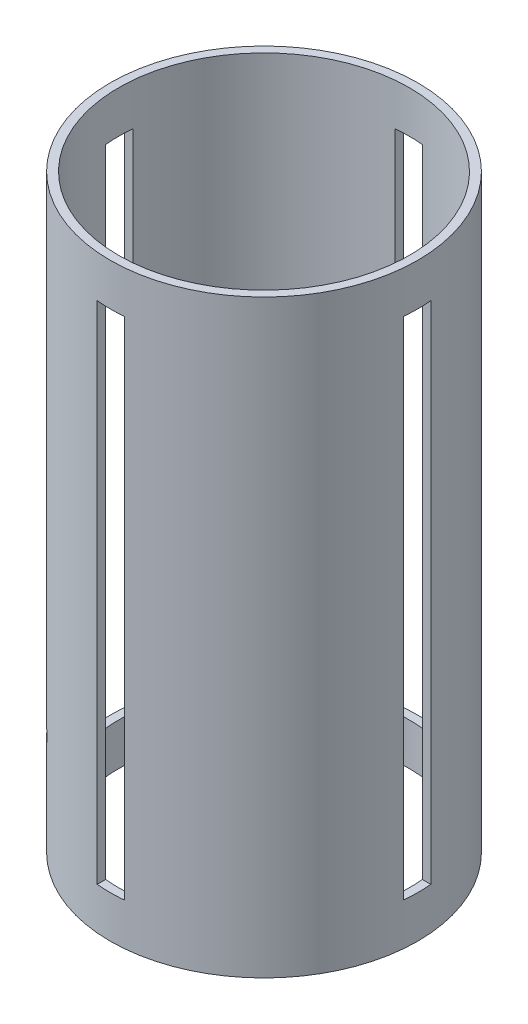
ISO-10303-21;
HEADER;
FILE_DESCRIPTION(('STEP AP214'),'2;1');
FILE_NAME('part.step','',(''),(''),'','','');
FILE_SCHEMA(('AUTOMOTIVE_DESIGN { 1 0 10303 214 1 1 1 1 }'));
ENDSEC;
DATA;
#1=APPLICATION_CONTEXT('core data for automotive mechanical design processes');
#2=APPLICATION_PROTOCOL_DEFINITION('international standard','automotive_design',2000,#1);
#3=PRODUCT_CONTEXT('',#1,'mechanical');
#4=PRODUCT('Part','Part','',(#3));
#5=PRODUCT_RELATED_PRODUCT_CATEGORY('part','',(#4));
#6=PRODUCT_DEFINITION_FORMATION('','',#4);
#7=PRODUCT_DEFINITION_CONTEXT('part definition',#1,'design');
#8=PRODUCT_DEFINITION('design','',#6,#7);
#9=PRODUCT_DEFINITION_SHAPE('','',#8);
#10=(LENGTH_UNIT() NAMED_UNIT(*) SI_UNIT(.MILLI.,.METRE.));
#11=(NAMED_UNIT(*) PLANE_ANGLE_UNIT() SI_UNIT($,.RADIAN.));
#12=(NAMED_UNIT(*) SI_UNIT($,.STERADIAN.) SOLID_ANGLE_UNIT());
#13=UNCERTAINTY_MEASURE_WITH_UNIT(LENGTH_MEASURE(1.E-05),#10,'distance_accuracy_value','');
#14=(GEOMETRIC_REPRESENTATION_CONTEXT(3) GLOBAL_UNCERTAINTY_ASSIGNED_CONTEXT((#13)) GLOBAL_UNIT_ASSIGNED_CONTEXT((#10,
#11,#12)) REPRESENTATION_CONTEXT('',''));
#15=CARTESIAN_POINT('',(0.,0.,0.));
#16=DIRECTION('',(0.,0.,1.));
#17=DIRECTION('',(1.,0.,0.));
#18=AXIS2_PLACEMENT_3D('',#15,#16,#17);
#19=CARTESIAN_POINT('',(0.,140.,0.));
#20=DIRECTION('',(0.,-1.,0.));
#21=DIRECTION('',(0.,0.,-1.));
#22=AXIS2_PLACEMENT_3D('',#19,#20,#21);
#23=CYLINDRICAL_SURFACE('',#22,36.5);
#24=DIRECTION('',(0.,-1.,0.));
#25=VECTOR('',#24,1.);
#26=CARTESIAN_POINT('',(36.3550202860623,140.,-3.24999999999989));
#27=LINE('',#26,#25);
#28=CARTESIAN_POINT('',(36.3550202860623,130.,-3.24999999999989));
#29=VERTEX_POINT('',#28);
#30=CARTESIAN_POINT('',(36.3550202860623,10.,-3.24999999999987));
#31=VERTEX_POINT('',#30);
#32=EDGE_CURVE('E269',#29,#31,#27,.T.);
#33=ORIENTED_EDGE('',*,*,#32,.T.);
#34=CARTESIAN_POINT('',(0.,10.,0.));
#35=DIRECTION('',(0.,-1.,0.));
#36=DIRECTION('',(0.,0.,-1.));
#37=AXIS2_PLACEMENT_3D('',#34,#35,#36);
#38=CIRCLE('',#37,36.5);
#39=CARTESIAN_POINT('',(36.3550202860623,10.,3.25000000000013));
#40=VERTEX_POINT('',#39);
#41=EDGE_CURVE('E61',#31,#40,#38,.T.);
#42=ORIENTED_EDGE('',*,*,#41,.T.);
#43=DIRECTION('',(0.,-1.,0.));
#44=VECTOR('',#43,1.);
#45=CARTESIAN_POINT('',(36.3550202860623,140.,3.25000000000011));
#46=LINE('',#45,#44);
#47=CARTESIAN_POINT('',(36.3550202860623,130.,3.25000000000011));
#48=VERTEX_POINT('',#47);
#49=EDGE_CURVE('E179',#40,#48,#46,.F.);
#50=ORIENTED_EDGE('',*,*,#49,.T.);
#51=CARTESIAN_POINT('',(0.,130.,0.));
#52=DIRECTION('',(0.,1.,0.));
#53=DIRECTION('',(0.,0.,1.));
#54=AXIS2_PLACEMENT_3D('',#51,#52,#53);
#55=CIRCLE('',#54,36.5);
#56=EDGE_CURVE('E289',#48,#29,#55,.T.);
#57=ORIENTED_EDGE('',*,*,#56,.T.);
#58=EDGE_LOOP('',(#33,#42,#50,#57));
#59=FACE_BOUND('',#58,.T.);
#60=DIRECTION('',(0.,-1.,0.));
#61=VECTOR('',#60,1.);
#62=CARTESIAN_POINT('',(-36.3550202860623,140.,3.24999999999986));
#63=LINE('',#62,#61);
#64=CARTESIAN_POINT('',(-36.3550202860623,130.,3.24999999999986));
#65=VERTEX_POINT('',#64);
#66=CARTESIAN_POINT('',(-36.3550202860623,10.,3.24999999999987));
#67=VERTEX_POINT('',#66);
#68=EDGE_CURVE('E293',#65,#67,#63,.T.);
#69=ORIENTED_EDGE('',*,*,#68,.T.);
#70=CARTESIAN_POINT('',(-36.3550202860623,10.,-3.25000000000013));
#71=VERTEX_POINT('',#70);
#72=EDGE_CURVE('E69',#67,#71,#38,.T.);
#73=ORIENTED_EDGE('',*,*,#72,.T.);
#74=DIRECTION('',(0.,-1.,0.));
#75=VECTOR('',#74,1.);
#76=CARTESIAN_POINT('',(-36.3550202860623,140.,-3.25000000000014));
#77=LINE('',#76,#75);
#78=CARTESIAN_POINT('',(-36.3550202860623,130.,-3.25000000000014));
#79=VERTEX_POINT('',#78);
#80=EDGE_CURVE('E286',#71,#79,#77,.F.);
#81=ORIENTED_EDGE('',*,*,#80,.T.);
#82=EDGE_CURVE('E292',#79,#65,#55,.T.);
#83=ORIENTED_EDGE('',*,*,#82,.T.);
#84=EDGE_LOOP('',(#69,#73,#81,#83));
#85=FACE_BOUND('',#84,.T.);
#86=DIRECTION('',(0.,-1.,0.));
#87=VECTOR('',#86,1.);
#88=CARTESIAN_POINT('',(3.24999999999998,140.,-36.3550202860623));
#89=LINE('',#88,#87);
#90=CARTESIAN_POINT('',(3.25,10.,-36.3550202860623));
#91=VERTEX_POINT('',#90);
#92=CARTESIAN_POINT('',(3.24999999999999,130.,-36.3550202860623));
#93=VERTEX_POINT('',#92);
#94=EDGE_CURVE('E255',#91,#93,#89,.F.);
#95=ORIENTED_EDGE('',*,*,#94,.T.);
#96=CARTESIAN_POINT('',(0.,130.,0.));
#97=DIRECTION('',(0.,1.,0.));
#98=DIRECTION('',(0.,0.,1.));
#99=AXIS2_PLACEMENT_3D('',#96,#97,#98);
#100=CIRCLE('',#99,36.5);
#101=CARTESIAN_POINT('',(-3.25000000000002,130.,-36.3550202860623));
#102=VERTEX_POINT('',#101);
#103=EDGE_CURVE('E247',#93,#102,#100,.T.);
#104=ORIENTED_EDGE('',*,*,#103,.T.);
#105=DIRECTION('',(0.,-1.,0.));
#106=VECTOR('',#105,1.);
#107=CARTESIAN_POINT('',(-3.25000000000002,140.,-36.3550202860623));
#108=LINE('',#107,#106);
#109=CARTESIAN_POINT('',(-3.25,10.,-36.3550202860623));
#110=VERTEX_POINT('',#109);
#111=EDGE_CURVE('E236',#102,#110,#108,.T.);
#112=ORIENTED_EDGE('',*,*,#111,.T.);
#113=CARTESIAN_POINT('',(0.,10.,0.));
#114=DIRECTION('',(0.,-1.,0.));
#115=DIRECTION('',(0.,0.,-1.));
#116=AXIS2_PLACEMENT_3D('',#113,#114,#115);
#117=CIRCLE('',#116,36.5);
#118=EDGE_CURVE('E260',#110,#91,#117,.T.);
#119=ORIENTED_EDGE('',*,*,#118,.T.);
#120=EDGE_LOOP('',(#95,#104,#112,#119));
#121=FACE_BOUND('',#120,.T.);
#122=CARTESIAN_POINT('',(-3.25000000000002,130.,36.3550202860623));
#123=VERTEX_POINT('',#122);
#124=CARTESIAN_POINT('',(3.24999999999999,130.,36.3550202860623));
#125=VERTEX_POINT('',#124);
#126=EDGE_CURVE('E248',#123,#125,#100,.T.);
#127=ORIENTED_EDGE('',*,*,#126,.T.);
#128=DIRECTION('',(0.,-1.,0.));
#129=VECTOR('',#128,1.);
#130=CARTESIAN_POINT('',(3.24999999999998,140.,36.3550202860623));
#131=LINE('',#130,#129);
#132=CARTESIAN_POINT('',(3.25,10.,36.3550202860623));
#133=VERTEX_POINT('',#132);
#134=EDGE_CURVE('E251',#125,#133,#131,.T.);
#135=ORIENTED_EDGE('',*,*,#134,.T.);
#136=CARTESIAN_POINT('',(-3.25,10.,36.3550202860623));
#137=VERTEX_POINT('',#136);
#138=EDGE_CURVE('E259',#133,#137,#117,.T.);
#139=ORIENTED_EDGE('',*,*,#138,.T.);
#140=DIRECTION('',(0.,-1.,0.));
#141=VECTOR('',#140,1.);
#142=CARTESIAN_POINT('',(-3.25000000000002,140.,36.3550202860623));
#143=LINE('',#142,#141);
#144=EDGE_CURVE('E243',#137,#123,#143,.F.);
#145=ORIENTED_EDGE('',*,*,#144,.T.);
#146=EDGE_LOOP('',(#127,#135,#139,#145));
#147=FACE_BOUND('',#146,.T.);
#148=CARTESIAN_POINT('',(0.,140.,0.));
#149=DIRECTION('',(0.,1.,0.));
#150=DIRECTION('',(0.,0.,1.));
#151=AXIS2_PLACEMENT_3D('',#148,#149,#150);
#152=CIRCLE('',#151,36.5);
#153=CARTESIAN_POINT('',(0.,140.,36.5));
#154=VERTEX_POINT('',#153);
#155=EDGE_CURVE('E223',#154,#154,#152,.T.);
#156=ORIENTED_EDGE('',*,*,#155,.F.);
#157=EDGE_LOOP('',(#156));
#158=FACE_BOUND('',#157,.T.);
#159=CARTESIAN_POINT('',(0.,0.,0.));
#160=DIRECTION('',(0.,1.,0.));
#161=DIRECTION('',(0.,0.,1.));
#162=AXIS2_PLACEMENT_3D('',#159,#160,#161);
#163=CIRCLE('',#162,36.5);
#164=CARTESIAN_POINT('',(0.,0.,36.5));
#165=VERTEX_POINT('',#164);
#166=EDGE_CURVE('E224',#165,#165,#163,.T.);
#167=ORIENTED_EDGE('',*,*,#166,.T.);
#168=EDGE_LOOP('',(#167));
#169=FACE_BOUND('',#168,.T.);
#170=CARTESIAN_POINT('',(-27.1848363720764,25.,24.3564092473302));
#171=CARTESIAN_POINT('',(-27.1848333928059,24.8877496337309,24.3564132668244));
#172=CARTESIAN_POINT('',(-27.1785023314782,24.7754200221964,24.3634845738636));
#173=CARTESIAN_POINT('',(-27.1533061587008,24.553860626019,24.3915622036233));
#174=CARTESIAN_POINT('',(-27.1344263429809,24.4446346348624,24.4125848741059));
#175=CARTESIAN_POINT('',(-27.0845845423868,24.2325239854131,24.4678698968994));
#176=CARTESIAN_POINT('',(-27.0536287946845,24.1296360852348,24.5021254144071));
#177=CARTESIAN_POINT('',(-26.9803846297015,23.933088357554,24.5827540624911));
#178=CARTESIAN_POINT('',(-26.9380988587944,23.8394263821137,24.6291243633331));
#179=CARTESIAN_POINT('',(-26.8431673702806,23.6638504511339,24.7325551337432));
#180=CARTESIAN_POINT('',(-26.7905108937461,23.5819488500927,24.7896267022019));
#181=CARTESIAN_POINT('',(-26.6761671949032,23.4323240524347,24.9126301296113));
#182=CARTESIAN_POINT('',(-26.6144796012882,23.3646014390532,24.978562352851));
#183=CARTESIAN_POINT('',(-26.4836000799651,23.245221442912,25.1172851212632));
#184=CARTESIAN_POINT('',(-26.4144035837307,23.1935739152184,25.1900798381022));
#185=CARTESIAN_POINT('',(-26.2703478055422,23.1078733613536,25.3402770877417));
#186=CARTESIAN_POINT('',(-26.1954885727898,23.0738201823312,25.4176795805054));
#187=CARTESIAN_POINT('',(-26.0422058017519,23.0243082428008,25.5747050122696));
#188=CARTESIAN_POINT('',(-25.963785955062,23.0088306604733,25.6543256198842));
#189=CARTESIAN_POINT('',(-25.8054913111543,22.9968511654011,25.8135471876617));
#190=CARTESIAN_POINT('',(-25.7256165271627,23.0003490802466,25.8931481479967));
#191=CARTESIAN_POINT('',(-25.5667816009529,23.026205703287,26.0499928262741));
#192=CARTESIAN_POINT('',(-25.4878205688055,23.0485441576169,26.1272389833053));
#193=CARTESIAN_POINT('',(-25.3330364331527,23.1114163439481,26.2773456786124));
#194=CARTESIAN_POINT('',(-25.2572133447439,23.1519501634771,26.3502061957897));
#195=CARTESIAN_POINT('',(-25.1109348167828,23.250085510873,26.4896428841843));
#196=CARTESIAN_POINT('',(-25.0404822997077,23.307696249221,26.5562156384639));
#197=CARTESIAN_POINT('',(-24.9071427795264,23.4383433608374,26.6813157557572));
#198=CARTESIAN_POINT('',(-24.8442558411894,23.5113798661515,26.7398430498942));
#199=CARTESIAN_POINT('',(-24.7279292240963,23.670919733767,26.8474545858677));
#200=CARTESIAN_POINT('',(-24.6745020714463,23.7574406706985,26.8965263146602));
#201=CARTESIAN_POINT('',(-24.5788946686228,23.9414317103252,26.9839238465798));
#202=CARTESIAN_POINT('',(-24.5367144219163,24.0389018163955,27.0222496463943));
#203=CARTESIAN_POINT('',(-24.4649620451195,24.2420352662587,27.0872292221082));
#204=CARTESIAN_POINT('',(-24.4353904249396,24.3476989412067,27.1138825259568));
#205=CARTESIAN_POINT('',(-24.3898270299135,24.5642151809549,27.1548758945644));
#206=CARTESIAN_POINT('',(-24.3738351323895,24.67506769887,27.1692160705592));
#207=CARTESIAN_POINT('',(-24.3559714122698,24.8986606220702,27.1852313474044));
#208=CARTESIAN_POINT('',(-24.3540812592175,25.0113983855467,27.1869228898603));
#209=CARTESIAN_POINT('',(-24.3644352057652,25.2356972298866,27.1776441871581));
#210=CARTESIAN_POINT('',(-24.3766792490595,25.3472583154357,27.1666739924399));
#211=CARTESIAN_POINT('',(-24.4148850311204,25.5659677636391,27.1323430806336));
#212=CARTESIAN_POINT('',(-24.4408383889803,25.6731187792071,27.1089899335746));
#213=CARTESIAN_POINT('',(-24.5056080409628,25.8800482452874,27.0504541357362));
#214=CARTESIAN_POINT('',(-24.544424424655,25.9798266444556,27.0152714025832));
#215=CARTESIAN_POINT('',(-24.6337119342707,26.1692915913078,26.9338796958189));
#216=CARTESIAN_POINT('',(-24.6841950509716,26.2589676139987,26.8876593764113));
#217=CARTESIAN_POINT('',(-24.7951851268444,26.4255763085364,26.7853407002468));
#218=CARTESIAN_POINT('',(-24.8556921622493,26.5025088834588,26.7292422683654));
#219=CARTESIAN_POINT('',(-24.9849041369061,26.641529627246,26.6085019707911));
#220=CARTESIAN_POINT('',(-25.0536177359787,26.7036019038714,26.5438510723895));
#221=CARTESIAN_POINT('',(-25.1970737530187,26.8110313674308,26.4077117457373));
#222=CARTESIAN_POINT('',(-25.271816140814,26.8563886380115,26.3362233517058));
#223=CARTESIAN_POINT('',(-25.4250283889514,26.9290728249892,26.1883418986505));
#224=CARTESIAN_POINT('',(-25.5034961289117,26.9564098692478,26.1119516211587));
#225=CARTESIAN_POINT('',(-25.6618796444713,26.9923107639562,25.9563143569695));
#226=CARTESIAN_POINT('',(-25.7417954097265,27.0008747484596,25.8770673906751));
#227=CARTESIAN_POINT('',(-25.9006668722324,26.9989851527665,25.718049524364));
#228=CARTESIAN_POINT('',(-25.9796236903742,26.9885564796246,25.6382794470328));
#229=CARTESIAN_POINT('',(-26.1344763237357,26.9490291443711,25.4804116524067));
#230=CARTESIAN_POINT('',(-26.2103721333132,26.9199304478477,25.4023139381946));
#231=CARTESIAN_POINT('',(-26.3570441849206,26.8438943812541,25.2500970767369));
#232=CARTESIAN_POINT('',(-26.4278204123629,26.796956960357,25.1759779408279));
#233=CARTESIAN_POINT('',(-26.5623912280198,26.6865797577837,25.0339560395441));
#234=CARTESIAN_POINT('',(-26.6261860185695,26.623140454543,24.9660530940217));
#235=CARTESIAN_POINT('',(-26.7452413613788,26.4814697889341,24.8384721970902));
#236=CARTESIAN_POINT('',(-26.8004915826766,26.4032207707989,24.7788042115341));
#237=CARTESIAN_POINT('',(-26.901002154892,26.2341690547681,24.6696494585572));
#238=CARTESIAN_POINT('',(-26.9462600493244,26.1433632788581,24.6201651948761));
#239=CARTESIAN_POINT('',(-27.0257047752963,25.9516927629924,24.532932499965));
#240=CARTESIAN_POINT('',(-27.0598798258976,25.8508174671939,24.4951965587617));
#241=CARTESIAN_POINT('',(-27.1162388594882,25.6420222735774,24.4327930203245));
#242=CARTESIAN_POINT('',(-27.1384369638588,25.5341108407762,24.408110033731));
#243=CARTESIAN_POINT('',(-27.1645162768212,25.3546104755876,24.379074396423));
#244=CARTESIAN_POINT('',(-27.1721279237578,25.2841833822549,24.3705872509354));
#245=CARTESIAN_POINT('',(-27.1822889145885,25.1425148416025,24.3592534032425));
#246=CARTESIAN_POINT('',(-27.1848382637649,25.0712733951326,24.3564066951515));
#247=CARTESIAN_POINT('',(-27.1848363720764,25.,24.3564092473302));
#248=B_SPLINE_CURVE_WITH_KNOTS('',3,(#170,#171,#172,#173,#174,#175,#176,#177,#178,#179,#180,
#181,#182,#183,#184,#185,#186,#187,#188,#189,#190,#191,#192,#193,#194,#195,#196,#197,#198,#199,
#200,#201,#202,#203,#204,#205,#206,#207,#208,#209,#210,#211,#212,#213,#214,#215,#216,#217,#218,
#219,#220,#221,#222,#223,#224,#225,#226,#227,#228,#229,#230,#231,#232,#233,#234,#235,#236,#237,
#238,#239,#240,#241,#242,#243,#244,#245,#246,#247),.UNSPECIFIED.,.T.,.F.,(4,2,2,2,2,2,2,2,2,2,2,
2,2,2,2,2,2,2,2,2,2,2,2,2,2,2,2,2,2,2,2,2,2,2,2,2,2,2,4),(0.,0.336490917464384,0.6733768220816,
1.01008895632446,1.34672251257509,1.68370716137262,2.02070566889815,2.357910373177,
2.69511214793407,3.03197196200468,3.36882871540036,3.70532380357655,4.04182051045838,
4.37849903898555,4.71518044962275,5.05230439366281,5.38942844162797,5.72656612206876,
6.06370075680892,6.40039708334733,6.73709206861113,7.07358146014923,7.41007319483073,
7.74691231759486,8.08375400218044,8.42095432638573,8.7581529631218,9.09516192302277,
9.43216847641815,9.76873339613805,10.1052989362043,10.4418654352345,10.7784221773502,
11.1153827105104,11.4524259890775,11.7898263753606,12.1268280765939,12.3404832827366,
12.5541382659326),.UNSPECIFIED.);
#249=CARTESIAN_POINT('',(-27.1848363720764,25.,24.3564092473302));
#250=VERTEX_POINT('',#249);
#251=EDGE_CURVE('E302',#250,#250,#248,.T.);
#252=ORIENTED_EDGE('',*,*,#251,.F.);
#253=EDGE_LOOP('',(#252));
#254=FACE_BOUND('',#253,.T.);
#255=ADVANCED_FACE('F39',(#59,#85,#121,#147,#158,#169,#254),#23,.T.);
#256=CARTESIAN_POINT('',(0.,140.,0.));
#257=DIRECTION('',(0.,-1.,0.));
#258=DIRECTION('',(0.,0.,-1.));
#259=AXIS2_PLACEMENT_3D('',#256,#257,#258);
#260=CYLINDRICAL_SURFACE('',#259,34.5);
#261=CARTESIAN_POINT('',(0.,0.,0.));
#262=DIRECTION('',(0.,1.,0.));
#263=DIRECTION('',(0.,0.,1.));
#264=AXIS2_PLACEMENT_3D('',#261,#262,#263);
#265=CIRCLE('',#264,34.5);
#266=CARTESIAN_POINT('',(0.,0.,34.5));
#267=VERTEX_POINT('',#266);
#268=EDGE_CURVE('E232',#267,#267,#265,.T.);
#269=ORIENTED_EDGE('',*,*,#268,.F.);
#270=EDGE_LOOP('',(#269));
#271=FACE_BOUND('',#270,.T.);
#272=CARTESIAN_POINT('',(0.,140.,0.));
#273=DIRECTION('',(0.,1.,0.));
#274=DIRECTION('',(0.,0.,1.));
#275=AXIS2_PLACEMENT_3D('',#272,#273,#274);
#276=CIRCLE('',#275,34.5);
#277=CARTESIAN_POINT('',(0.,140.,34.5));
#278=VERTEX_POINT('',#277);
#279=EDGE_CURVE('E228',#278,#278,#276,.T.);
#280=ORIENTED_EDGE('',*,*,#279,.T.);
#281=EDGE_LOOP('',(#280));
#282=FACE_BOUND('',#281,.T.);
#283=DIRECTION('',(0.,-1.,0.));
#284=VECTOR('',#283,1.);
#285=CARTESIAN_POINT('',(-3.25000000000002,140.,-34.3465791600852));
#286=LINE('',#285,#284);
#287=CARTESIAN_POINT('',(-3.25000000000002,130.,-34.3465791600852));
#288=VERTEX_POINT('',#287);
#289=CARTESIAN_POINT('',(-3.25,10.,-34.3465791600852));
#290=VERTEX_POINT('',#289);
#291=EDGE_CURVE('E210',#288,#290,#286,.T.);
#292=ORIENTED_EDGE('',*,*,#291,.F.);
#293=CARTESIAN_POINT('',(0.,130.,0.));
#294=DIRECTION('',(0.,1.,0.));
#295=DIRECTION('',(0.,0.,1.));
#296=AXIS2_PLACEMENT_3D('',#293,#294,#295);
#297=CIRCLE('',#296,34.5);
#298=CARTESIAN_POINT('',(3.24999999999999,130.,-34.3465791600852));
#299=VERTEX_POINT('',#298);
#300=EDGE_CURVE('E214',#299,#288,#297,.T.);
#301=ORIENTED_EDGE('',*,*,#300,.F.);
#302=DIRECTION('',(0.,-1.,0.));
#303=VECTOR('',#302,1.);
#304=CARTESIAN_POINT('',(3.24999999999998,140.,-34.3465791600852));
#305=LINE('',#304,#303);
#306=CARTESIAN_POINT('',(3.25,10.,-34.3465791600852));
#307=VERTEX_POINT('',#306);
#308=EDGE_CURVE('E217',#307,#299,#305,.F.);
#309=ORIENTED_EDGE('',*,*,#308,.F.);
#310=CARTESIAN_POINT('',(0.,10.,0.));
#311=DIRECTION('',(0.,-1.,0.));
#312=DIRECTION('',(0.,0.,-1.));
#313=AXIS2_PLACEMENT_3D('',#310,#311,#312);
#314=CIRCLE('',#313,34.5);
#315=EDGE_CURVE('E220',#290,#307,#314,.T.);
#316=ORIENTED_EDGE('',*,*,#315,.F.);
#317=EDGE_LOOP('',(#292,#301,#309,#316));
#318=FACE_BOUND('',#317,.T.);
#319=DIRECTION('',(0.,-1.,0.));
#320=VECTOR('',#319,1.);
#321=CARTESIAN_POINT('',(-3.25000000000002,140.,34.3465791600852));
#322=LINE('',#321,#320);
#323=CARTESIAN_POINT('',(-3.25,10.,34.3465791600852));
#324=VERTEX_POINT('',#323);
#325=CARTESIAN_POINT('',(-3.25000000000002,130.,34.3465791600852));
#326=VERTEX_POINT('',#325);
#327=EDGE_CURVE('E201',#324,#326,#322,.F.);
#328=ORIENTED_EDGE('',*,*,#327,.F.);
#329=CARTESIAN_POINT('',(3.25,10.,34.3465791600852));
#330=VERTEX_POINT('',#329);
#331=EDGE_CURVE('E209',#330,#324,#314,.T.);
#332=ORIENTED_EDGE('',*,*,#331,.F.);
#333=DIRECTION('',(0.,-1.,0.));
#334=VECTOR('',#333,1.);
#335=CARTESIAN_POINT('',(3.24999999999998,140.,34.3465791600852));
#336=LINE('',#335,#334);
#337=CARTESIAN_POINT('',(3.24999999999999,130.,34.3465791600852));
#338=VERTEX_POINT('',#337);
#339=EDGE_CURVE('E205',#338,#330,#336,.T.);
#340=ORIENTED_EDGE('',*,*,#339,.F.);
#341=EDGE_CURVE('E204',#326,#338,#297,.T.);
#342=ORIENTED_EDGE('',*,*,#341,.F.);
#343=EDGE_LOOP('',(#328,#332,#340,#342));
#344=FACE_BOUND('',#343,.T.);
#345=DIRECTION('',(0.,-1.,0.));
#346=VECTOR('',#345,1.);
#347=CARTESIAN_POINT('',(-34.3465791600852,140.,-3.25000000000014));
#348=LINE('',#347,#346);
#349=CARTESIAN_POINT('',(-34.3465791600852,10.,-3.25000000000012));
#350=VERTEX_POINT('',#349);
#351=CARTESIAN_POINT('',(-34.3465791600852,130.,-3.25000000000014));
#352=VERTEX_POINT('',#351);
#353=EDGE_CURVE('E172',#350,#352,#348,.F.);
#354=ORIENTED_EDGE('',*,*,#353,.F.);
#355=CARTESIAN_POINT('',(0.,10.,0.));
#356=DIRECTION('',(0.,-1.,0.));
#357=DIRECTION('',(0.,0.,-1.));
#358=AXIS2_PLACEMENT_3D('',#355,#356,#357);
#359=CIRCLE('',#358,34.5);
#360=CARTESIAN_POINT('',(-34.3465791600852,10.,3.24999999999988));
#361=VERTEX_POINT('',#360);
#362=EDGE_CURVE('E174',#361,#350,#359,.T.);
#363=ORIENTED_EDGE('',*,*,#362,.F.);
#364=DIRECTION('',(0.,-1.,0.));
#365=VECTOR('',#364,1.);
#366=CARTESIAN_POINT('',(-34.3465791600852,140.,3.24999999999986));
#367=LINE('',#366,#365);
#368=CARTESIAN_POINT('',(-34.3465791600852,130.,3.24999999999987));
#369=VERTEX_POINT('',#368);
#370=EDGE_CURVE('E196',#369,#361,#367,.T.);
#371=ORIENTED_EDGE('',*,*,#370,.F.);
#372=CARTESIAN_POINT('',(0.,130.,0.));
#373=DIRECTION('',(0.,1.,0.));
#374=DIRECTION('',(0.,0.,1.));
#375=AXIS2_PLACEMENT_3D('',#372,#373,#374);
#376=CIRCLE('',#375,34.5);
#377=EDGE_CURVE('E191',#352,#369,#376,.T.);
#378=ORIENTED_EDGE('',*,*,#377,.F.);
#379=EDGE_LOOP('',(#354,#363,#371,#378));
#380=FACE_BOUND('',#379,.T.);
#381=DIRECTION('',(0.,-1.,0.));
#382=VECTOR('',#381,1.);
#383=CARTESIAN_POINT('',(34.3465791600852,140.,-3.2499999999999));
#384=LINE('',#383,#382);
#385=CARTESIAN_POINT('',(34.3465791600852,130.,-3.24999999999989));
#386=VERTEX_POINT('',#385);
#387=CARTESIAN_POINT('',(34.3465791600852,10.,-3.24999999999988));
#388=VERTEX_POINT('',#387);
#389=EDGE_CURVE('E11',#386,#388,#384,.T.);
#390=ORIENTED_EDGE('',*,*,#389,.F.);
#391=CARTESIAN_POINT('',(34.3465791600852,130.,3.25000000000011));
#392=VERTEX_POINT('',#391);
#393=EDGE_CURVE('E54',#392,#386,#376,.T.);
#394=ORIENTED_EDGE('',*,*,#393,.F.);
#395=DIRECTION('',(0.,-1.,0.));
#396=VECTOR('',#395,1.);
#397=CARTESIAN_POINT('',(34.3465791600852,140.,3.2500000000001));
#398=LINE('',#397,#396);
#399=CARTESIAN_POINT('',(34.3465791600852,10.,3.25000000000012));
#400=VERTEX_POINT('',#399);
#401=EDGE_CURVE('E171',#400,#392,#398,.F.);
#402=ORIENTED_EDGE('',*,*,#401,.F.);
#403=EDGE_CURVE('E160',#388,#400,#359,.T.);
#404=ORIENTED_EDGE('',*,*,#403,.F.);
#405=EDGE_LOOP('',(#390,#394,#402,#404));
#406=FACE_BOUND('',#405,.T.);
#407=CARTESIAN_POINT('',(-25.7683713182882,25.,22.939944193542));
#408=CARTESIAN_POINT('',(-25.768368371638,24.8877604369635,22.9399482396604));
#409=CARTESIAN_POINT('',(-25.7620600472087,24.775441892752,22.9470397146951));
#410=CARTESIAN_POINT('',(-25.7369527564426,24.5539050681071,22.9751954262255));
#411=CARTESIAN_POINT('',(-25.7181391822274,24.4446905693991,22.9962760038996));
#412=CARTESIAN_POINT('',(-25.668466729383,24.2326029644868,23.0517069366468));
#413=CARTESIAN_POINT('',(-25.6376141243602,24.1297265877292,23.0860503802701));
#414=CARTESIAN_POINT('',(-25.5646023316126,23.9331996281313,23.1668741759566));
#415=CARTESIAN_POINT('',(-25.5224457638178,23.8395469143823,23.2133517156231));
#416=CARTESIAN_POINT('',(-25.4277797317588,23.6639755222975,23.317009575931));
#417=CARTESIAN_POINT('',(-25.3752583665664,23.5820705212074,23.3742021958385));
#418=CARTESIAN_POINT('',(-25.2611796114682,23.432436440881,23.4974432724757));
#419=CARTESIAN_POINT('',(-25.1996218479885,23.364707947997,23.56349209532));
#420=CARTESIAN_POINT('',(-25.0689769230879,23.2453090120257,23.7024361995708));
#421=CARTESIAN_POINT('',(-24.9998846154091,23.193649638457,23.775336155694));
#422=CARTESIAN_POINT('',(-24.8560038163417,23.1079262943207,23.9257161249791));
#423=CARTESIAN_POINT('',(-24.7812153789957,23.0738621568399,24.003196094686));
#424=CARTESIAN_POINT('',(-24.6280421093557,23.0243335126346,24.160330296972));
#425=CARTESIAN_POINT('',(-24.5496614554265,23.0088479386596,24.2399819618812));
#426=CARTESIAN_POINT('',(-24.391401282182,22.9968509572387,24.399224221131));
#427=CARTESIAN_POINT('',(-24.311521777792,23.0003393609534,24.4788148160716));
#428=CARTESIAN_POINT('',(-24.1526451296847,23.0261738955269,24.6355876130821));
#429=CARTESIAN_POINT('',(-24.0736470409704,23.0484973595565,24.7127725944366));
#430=CARTESIAN_POINT('',(-23.9187509808607,23.1113331731087,24.8627226841356));
#431=CARTESIAN_POINT('',(-23.8428530257383,23.1518456180937,24.9354877692805));
#432=CARTESIAN_POINT('',(-23.6963905387969,23.2499351301531,25.074714403176));
#433=CARTESIAN_POINT('',(-23.625829256506,23.3075224908958,25.1411721175126));
#434=CARTESIAN_POINT('',(-23.4922545114162,23.4381196419027,25.266031554636));
#435=CARTESIAN_POINT('',(-23.4292411212952,23.5111295806507,25.3244331998524));
#436=CARTESIAN_POINT('',(-23.3126474728029,23.6706274687196,25.4318063251064));
#437=CARTESIAN_POINT('',(-23.2590812286534,23.7571350886035,25.480763805268));
#438=CARTESIAN_POINT('',(-23.163208159783,23.9411037173248,25.5679486951343));
#439=CARTESIAN_POINT('',(-23.1209013389104,24.038564729906,25.6061761011717));
#440=CARTESIAN_POINT('',(-23.0489215244503,24.2416859294347,25.6709870103639));
#441=CARTESIAN_POINT('',(-23.0192491193554,24.3473464980346,25.6975699711393));
#442=CARTESIAN_POINT('',(-22.9735211716688,24.5638618670206,25.7384590452588));
#443=CARTESIAN_POINT('',(-22.9574654913503,24.674716614858,25.7527652827762));
#444=CARTESIAN_POINT('',(-22.9395192343562,24.8983008834573,25.7687524848465));
#445=CARTESIAN_POINT('',(-22.9376080800617,25.011027441527,25.7704517901179));
#446=CARTESIAN_POINT('',(-22.9479603246912,25.2353072475072,25.7612337265943));
#447=CARTESIAN_POINT('',(-22.9602236603024,25.3468605006562,25.7503164141536));
#448=CARTESIAN_POINT('',(-22.9985028539664,25.565549490987,25.7161334070322));
#449=CARTESIAN_POINT('',(-23.0245092904773,25.6726882003711,25.6928761719046));
#450=CARTESIAN_POINT('',(-23.0894111015704,25.8795984985971,25.6345662550462));
#451=CARTESIAN_POINT('',(-23.12830657668,25.9793700299716,25.5995134813168));
#452=CARTESIAN_POINT('',(-23.2177728994167,26.1688403109427,25.5183984201709));
#453=CARTESIAN_POINT('',(-23.2683571803534,26.2585272932525,25.4723234633936));
#454=CARTESIAN_POINT('',(-23.3795547543868,26.4251641190553,25.3702995230183));
#455=CARTESIAN_POINT('',(-23.4401681324381,26.5021138546427,25.3143504557784));
#456=CARTESIAN_POINT('',(-23.5695936403626,26.6411846367148,25.1938894466375));
#457=CARTESIAN_POINT('',(-23.6384154625786,26.7032878877148,25.1293673714732));
#458=CARTESIAN_POINT('',(-23.7820699125706,26.810781091875,24.9934574370878));
#459=CARTESIAN_POINT('',(-23.8569025074837,26.856171136404,24.9220696154036));
#460=CARTESIAN_POINT('',(-24.0102615557757,26.9289184526699,24.7743548491116));
#461=CARTESIAN_POINT('',(-24.0887856592435,26.9562870341956,24.6980310352968));
#462=CARTESIAN_POINT('',(-24.2472457288264,26.9922515529119,24.5424814483496));
#463=CARTESIAN_POINT('',(-24.3271816833453,27.0008476442181,24.4632556990464));
#464=CARTESIAN_POINT('',(-24.4860417796211,26.9990217016078,24.3042459304178));
#465=CARTESIAN_POINT('',(-24.5649672333764,26.9886275414127,24.2244629002686));
#466=CARTESIAN_POINT('',(-24.719720881114,26.9491738749024,24.0665250525364));
#467=CARTESIAN_POINT('',(-24.7955490694858,26.9201143347783,23.9883702379031));
#468=CARTESIAN_POINT('',(-24.9420568545552,26.8441608904087,23.8360017594874));
#469=CARTESIAN_POINT('',(-25.0127364554256,26.797267000618,23.7617880925109));
#470=CARTESIAN_POINT('',(-25.1470971292549,26.6869801678403,23.6195488954109));
#471=CARTESIAN_POINT('',(-25.2107783965613,26.6235876831927,23.5515231934534));
#472=CARTESIAN_POINT('',(-25.3296132359028,26.4820010720727,23.4236704058358));
#473=CARTESIAN_POINT('',(-25.3847551394504,26.4037870115841,23.3638545508639));
#474=CARTESIAN_POINT('',(-25.4850583606977,26.2348001614724,23.254404473572));
#475=CARTESIAN_POINT('',(-25.5302172275253,26.1440242967548,23.2047727517081));
#476=CARTESIAN_POINT('',(-25.6094894291591,25.9523994945106,23.1172565982589));
#477=CARTESIAN_POINT('',(-25.6435902116668,25.8515392786531,23.079385518512));
#478=CARTESIAN_POINT('',(-25.6998325996302,25.6427645509775,23.0167415865346));
#479=CARTESIAN_POINT('',(-25.7219882586415,25.5348584970416,22.9919533429453));
#480=CARTESIAN_POINT('',(-25.7480468522296,25.3552402103987,22.9627589369106));
#481=CARTESIAN_POINT('',(-25.7556601949621,25.2846899768564,22.9542158920279));
#482=CARTESIAN_POINT('',(-25.7658233622611,25.1427704824528,22.9428072367226));
#483=CARTESIAN_POINT('',(-25.7683731928004,25.0714012225578,22.9399416196029));
#484=CARTESIAN_POINT('',(-25.7683713182882,25.,22.939944193542));
#485=B_SPLINE_CURVE_WITH_KNOTS('',3,(#407,#408,#409,#410,#411,#412,#413,#414,#415,#416,#417,
#418,#419,#420,#421,#422,#423,#424,#425,#426,#427,#428,#429,#430,#431,#432,#433,#434,#435,#436,
#437,#438,#439,#440,#441,#442,#443,#444,#445,#446,#447,#448,#449,#450,#451,#452,#453,#454,#455,
#456,#457,#458,#459,#460,#461,#462,#463,#464,#465,#466,#467,#468,#469,#470,#471,#472,#473,#474,
#475,#476,#477,#478,#479,#480,#481,#482,#483,#484),.UNSPECIFIED.,.T.,.F.,(4,2,2,2,2,2,2,2,2,2,2,
2,2,2,2,2,2,2,2,2,2,2,2,2,2,2,2,2,2,2,2,2,2,2,2,2,2,2,4),(0.,0.336458036795515,
0.673309795913812,1.00998625360965,1.34658474683201,1.68357199721934,2.02057318292636,
2.35780600681018,2.69503563155348,3.03188249062549,3.36872599721833,3.70516471073691,
4.04160519002931,4.37824890737368,4.71489586596619,5.05203809292965,5.38918043512477,
5.72633847919543,6.06349311303005,6.40015715384108,6.73681969089209,7.07325172878337,
7.40968639072042,7.7465096388091,8.0833357402055,8.42056357058403,8.75778955735662,
9.09480370789568,9.43181509165806,9.76833221047361,10.1048499388318,10.4413673944422,
10.7778755024229,11.1148394450639,11.4518860219381,11.7893138600548,12.1263438398602,
12.3403819459811,12.5544197996281),.UNSPECIFIED.);
#486=CARTESIAN_POINT('',(-25.7683713182882,25.,22.939944193542));
#487=VERTEX_POINT('',#486);
#488=EDGE_CURVE('E43',#487,#487,#485,.T.);
#489=ORIENTED_EDGE('',*,*,#488,.T.);
#490=EDGE_LOOP('',(#489));
#491=FACE_BOUND('',#490,.T.);
#492=ADVANCED_FACE('F185',(#271,#282,#318,#344,#380,#406,#491),#260,.F.);
#493=CARTESIAN_POINT('',(0.,140.,0.));
#494=DIRECTION('',(0.,1.,0.));
#495=DIRECTION('',(0.,0.,1.));
#496=AXIS2_PLACEMENT_3D('',#493,#494,#495);
#497=PLANE('',#496);
#498=ORIENTED_EDGE('',*,*,#155,.T.);
#499=EDGE_LOOP('',(#498));
#500=FACE_BOUND('',#499,.T.);
#501=ORIENTED_EDGE('',*,*,#279,.F.);
#502=EDGE_LOOP('',(#501));
#503=FACE_BOUND('',#502,.T.);
#504=ADVANCED_FACE('F365',(#500,#503),#497,.T.);
#505=CARTESIAN_POINT('',(0.,0.,0.));
#506=DIRECTION('',(0.,1.,0.));
#507=DIRECTION('',(0.,0.,1.));
#508=AXIS2_PLACEMENT_3D('',#505,#506,#507);
#509=PLANE('',#508);
#510=ORIENTED_EDGE('',*,*,#166,.F.);
#511=EDGE_LOOP('',(#510));
#512=FACE_BOUND('',#511,.T.);
#513=ORIENTED_EDGE('',*,*,#268,.T.);
#514=EDGE_LOOP('',(#513));
#515=FACE_BOUND('',#514,.T.);
#516=ADVANCED_FACE('F368',(#512,#515),#509,.F.);
#517=CARTESIAN_POINT('',(-3.25,10.,-36.5));
#518=DIRECTION('',(0.,-1.,0.));
#519=DIRECTION('',(0.,0.,-1.));
#520=AXIS2_PLACEMENT_3D('',#517,#518,#519);
#521=PLANE('',#520);
#522=ORIENTED_EDGE('',*,*,#118,.F.);
#523=DIRECTION('',(0.,0.,1.));
#524=VECTOR('',#523,1.);
#525=CARTESIAN_POINT('',(-3.25,10.,-36.5));
#526=LINE('',#525,#524);
#527=EDGE_CURVE('E268',#110,#290,#526,.T.);
#528=ORIENTED_EDGE('',*,*,#527,.T.);
#529=ORIENTED_EDGE('',*,*,#315,.T.);
#530=DIRECTION('',(0.,0.,1.));
#531=VECTOR('',#530,1.);
#532=CARTESIAN_POINT('',(3.25,10.,-36.5));
#533=LINE('',#532,#531);
#534=EDGE_CURVE('E274',#91,#307,#533,.T.);
#535=ORIENTED_EDGE('',*,*,#534,.F.);
#536=EDGE_LOOP('',(#522,#528,#529,#535));
#537=FACE_BOUND('',#536,.T.);
#538=ADVANCED_FACE('F358',(#537),#521,.F.);
#539=CARTESIAN_POINT('',(3.24999999999999,130.,-36.5));
#540=DIRECTION('',(1.,0.,0.));
#541=DIRECTION('',(0.,1.,0.));
#542=AXIS2_PLACEMENT_3D('',#539,#540,#541);
#543=PLANE('',#542);
#544=ORIENTED_EDGE('',*,*,#534,.T.);
#545=ORIENTED_EDGE('',*,*,#308,.T.);
#546=DIRECTION('',(0.,0.,1.));
#547=VECTOR('',#546,1.);
#548=CARTESIAN_POINT('',(3.24999999999999,130.,-36.5));
#549=LINE('',#548,#547);
#550=EDGE_CURVE('E279',#93,#299,#549,.T.);
#551=ORIENTED_EDGE('',*,*,#550,.F.);
#552=ORIENTED_EDGE('',*,*,#94,.F.);
#553=EDGE_LOOP('',(#544,#545,#551,#552));
#554=FACE_BOUND('',#553,.T.);
#555=ADVANCED_FACE('F347',(#554),#543,.F.);
#556=CARTESIAN_POINT('',(-3.25000000000002,130.,-36.5));
#557=DIRECTION('',(0.,1.,0.));
#558=DIRECTION('',(0.,0.,1.));
#559=AXIS2_PLACEMENT_3D('',#556,#557,#558);
#560=PLANE('',#559);
#561=ORIENTED_EDGE('',*,*,#550,.T.);
#562=ORIENTED_EDGE('',*,*,#300,.T.);
#563=DIRECTION('',(0.,0.,1.));
#564=VECTOR('',#563,1.);
#565=CARTESIAN_POINT('',(-3.25000000000002,130.,-36.5));
#566=LINE('',#565,#564);
#567=EDGE_CURVE('E263',#102,#288,#566,.T.);
#568=ORIENTED_EDGE('',*,*,#567,.F.);
#569=ORIENTED_EDGE('',*,*,#103,.F.);
#570=EDGE_LOOP('',(#561,#562,#568,#569));
#571=FACE_BOUND('',#570,.T.);
#572=ADVANCED_FACE('F343',(#571),#560,.F.);
#573=CARTESIAN_POINT('',(-3.25000000000002,130.,-36.5));
#574=DIRECTION('',(-1.,0.,0.));
#575=DIRECTION('',(0.,-1.,0.));
#576=AXIS2_PLACEMENT_3D('',#573,#574,#575);
#577=PLANE('',#576);
#578=ORIENTED_EDGE('',*,*,#567,.T.);
#579=ORIENTED_EDGE('',*,*,#291,.T.);
#580=ORIENTED_EDGE('',*,*,#527,.F.);
#581=ORIENTED_EDGE('',*,*,#111,.F.);
#582=EDGE_LOOP('',(#578,#579,#580,#581));
#583=FACE_BOUND('',#582,.T.);
#584=ADVANCED_FACE('F346',(#583),#577,.F.);
#585=EDGE_CURVE('E264',#324,#137,#526,.T.);
#586=ORIENTED_EDGE('',*,*,#585,.F.);
#587=ORIENTED_EDGE('',*,*,#327,.T.);
#588=EDGE_CURVE('E280',#326,#123,#566,.T.);
#589=ORIENTED_EDGE('',*,*,#588,.T.);
#590=ORIENTED_EDGE('',*,*,#144,.F.);
#591=EDGE_LOOP('',(#586,#587,#589,#590));
#592=FACE_BOUND('',#591,.T.);
#593=ADVANCED_FACE('F360',(#592),#577,.F.);
#594=ORIENTED_EDGE('',*,*,#126,.F.);
#595=ORIENTED_EDGE('',*,*,#588,.F.);
#596=ORIENTED_EDGE('',*,*,#341,.T.);
#597=EDGE_CURVE('E275',#338,#125,#549,.T.);
#598=ORIENTED_EDGE('',*,*,#597,.T.);
#599=EDGE_LOOP('',(#594,#595,#596,#598));
#600=FACE_BOUND('',#599,.T.);
#601=ADVANCED_FACE('F349',(#600),#560,.F.);
#602=ORIENTED_EDGE('',*,*,#597,.F.);
#603=ORIENTED_EDGE('',*,*,#339,.T.);
#604=EDGE_CURVE('E270',#330,#133,#533,.T.);
#605=ORIENTED_EDGE('',*,*,#604,.T.);
#606=ORIENTED_EDGE('',*,*,#134,.F.);
#607=EDGE_LOOP('',(#602,#603,#605,#606));
#608=FACE_BOUND('',#607,.T.);
#609=ADVANCED_FACE('F350',(#608),#543,.F.);
#610=ORIENTED_EDGE('',*,*,#604,.F.);
#611=ORIENTED_EDGE('',*,*,#331,.T.);
#612=ORIENTED_EDGE('',*,*,#585,.T.);
#613=ORIENTED_EDGE('',*,*,#138,.F.);
#614=EDGE_LOOP('',(#610,#611,#612,#613));
#615=FACE_BOUND('',#614,.T.);
#616=ADVANCED_FACE('F353',(#615),#521,.F.);
#617=CARTESIAN_POINT('',(36.5000000000001,10.,-3.24999999999987));
#618=DIRECTION('',(0.,-1.,0.));
#619=DIRECTION('',(0.,0.,-1.));
#620=AXIS2_PLACEMENT_3D('',#617,#618,#619);
#621=PLANE('',#620);
#622=DIRECTION('',(-1.,0.,0.));
#623=VECTOR('',#622,1.);
#624=CARTESIAN_POINT('',(36.5000000000001,10.,3.25000000000013));
#625=LINE('',#624,#623);
#626=EDGE_CURVE('E182',#361,#67,#625,.T.);
#627=ORIENTED_EDGE('',*,*,#626,.F.);
#628=ORIENTED_EDGE('',*,*,#362,.T.);
#629=DIRECTION('',(-1.,0.,0.));
#630=VECTOR('',#629,1.);
#631=CARTESIAN_POINT('',(36.5000000000001,10.,-3.24999999999987));
#632=LINE('',#631,#630);
#633=EDGE_CURVE('E300',#350,#71,#632,.T.);
#634=ORIENTED_EDGE('',*,*,#633,.T.);
#635=ORIENTED_EDGE('',*,*,#72,.F.);
#636=EDGE_LOOP('',(#627,#628,#634,#635));
#637=FACE_BOUND('',#636,.T.);
#638=ADVANCED_FACE('F335',(#637),#621,.F.);
#639=CARTESIAN_POINT('',(36.5000000000001,130.,3.25000000000011));
#640=DIRECTION('',(0.,0.,1.));
#641=DIRECTION('',(1.,0.,0.));
#642=AXIS2_PLACEMENT_3D('',#639,#640,#641);
#643=PLANE('',#642);
#644=DIRECTION('',(-1.,0.,0.));
#645=VECTOR('',#644,1.);
#646=CARTESIAN_POINT('',(36.5000000000001,130.,3.25000000000011));
#647=LINE('',#646,#645);
#648=EDGE_CURVE('E181',#369,#65,#647,.T.);
#649=ORIENTED_EDGE('',*,*,#648,.F.);
#650=ORIENTED_EDGE('',*,*,#370,.T.);
#651=ORIENTED_EDGE('',*,*,#626,.T.);
#652=ORIENTED_EDGE('',*,*,#68,.F.);
#653=EDGE_LOOP('',(#649,#650,#651,#652));
#654=FACE_BOUND('',#653,.T.);
#655=ADVANCED_FACE('F332',(#654),#643,.F.);
#656=CARTESIAN_POINT('',(36.5000000000001,130.,-3.24999999999989));
#657=DIRECTION('',(0.,1.,0.));
#658=DIRECTION('',(0.,0.,1.));
#659=AXIS2_PLACEMENT_3D('',#656,#657,#658);
#660=PLANE('',#659);
#661=DIRECTION('',(-1.,0.,0.));
#662=VECTOR('',#661,1.);
#663=CARTESIAN_POINT('',(36.5000000000001,130.,-3.24999999999989));
#664=LINE('',#663,#662);
#665=EDGE_CURVE('E310',#352,#79,#664,.T.);
#666=ORIENTED_EDGE('',*,*,#665,.F.);
#667=ORIENTED_EDGE('',*,*,#377,.T.);
#668=ORIENTED_EDGE('',*,*,#648,.T.);
#669=ORIENTED_EDGE('',*,*,#82,.F.);
#670=EDGE_LOOP('',(#666,#667,#668,#669));
#671=FACE_BOUND('',#670,.T.);
#672=ADVANCED_FACE('F331',(#671),#660,.F.);
#673=CARTESIAN_POINT('',(36.5000000000001,130.,-3.24999999999989));
#674=DIRECTION('',(0.,0.,-1.));
#675=DIRECTION('',(-1.,0.,0.));
#676=AXIS2_PLACEMENT_3D('',#673,#674,#675);
#677=PLANE('',#676);
#678=ORIENTED_EDGE('',*,*,#633,.F.);
#679=ORIENTED_EDGE('',*,*,#353,.T.);
#680=ORIENTED_EDGE('',*,*,#665,.T.);
#681=ORIENTED_EDGE('',*,*,#80,.F.);
#682=EDGE_LOOP('',(#678,#679,#680,#681));
#683=FACE_BOUND('',#682,.T.);
#684=ADVANCED_FACE('F341',(#683),#677,.F.);
#685=EDGE_CURVE('E314',#29,#386,#664,.T.);
#686=ORIENTED_EDGE('',*,*,#685,.T.);
#687=ORIENTED_EDGE('',*,*,#389,.T.);
#688=EDGE_CURVE('E166',#31,#388,#632,.T.);
#689=ORIENTED_EDGE('',*,*,#688,.F.);
#690=ORIENTED_EDGE('',*,*,#32,.F.);
#691=EDGE_LOOP('',(#686,#687,#689,#690));
#692=FACE_BOUND('',#691,.T.);
#693=ADVANCED_FACE('F329',(#692),#677,.F.);
#694=EDGE_CURVE('E309',#48,#392,#647,.T.);
#695=ORIENTED_EDGE('',*,*,#694,.T.);
#696=ORIENTED_EDGE('',*,*,#393,.T.);
#697=ORIENTED_EDGE('',*,*,#685,.F.);
#698=ORIENTED_EDGE('',*,*,#56,.F.);
#699=EDGE_LOOP('',(#695,#696,#697,#698));
#700=FACE_BOUND('',#699,.T.);
#701=ADVANCED_FACE('F325',(#700),#660,.F.);
#702=EDGE_CURVE('E163',#40,#400,#625,.T.);
#703=ORIENTED_EDGE('',*,*,#702,.T.);
#704=ORIENTED_EDGE('',*,*,#401,.T.);
#705=ORIENTED_EDGE('',*,*,#694,.F.);
#706=ORIENTED_EDGE('',*,*,#49,.F.);
#707=EDGE_LOOP('',(#703,#704,#705,#706));
#708=FACE_BOUND('',#707,.T.);
#709=ADVANCED_FACE('F176',(#708),#643,.F.);
#710=ORIENTED_EDGE('',*,*,#688,.T.);
#711=ORIENTED_EDGE('',*,*,#403,.T.);
#712=ORIENTED_EDGE('',*,*,#702,.F.);
#713=ORIENTED_EDGE('',*,*,#41,.F.);
#714=EDGE_LOOP('',(#710,#711,#712,#713));
#715=FACE_BOUND('',#714,.T.);
#716=ADVANCED_FACE('F162',(#715),#621,.F.);
#717=CARTESIAN_POINT('',(-36.5000000000001,25.,36.5000000000001));
#718=DIRECTION('',(0.707106781186547,0.,-0.707106781186548));
#719=DIRECTION('',(-0.707106781186548,0.,-0.707106781186547));
#720=AXIS2_PLACEMENT_3D('',#717,#718,#719);
#721=CYLINDRICAL_SURFACE('',#720,2.);
#722=ORIENTED_EDGE('',*,*,#488,.F.);
#723=EDGE_LOOP('',(#722));
#724=FACE_BOUND('',#723,.T.);
#725=ORIENTED_EDGE('',*,*,#251,.T.);
#726=EDGE_LOOP('',(#725));
#727=FACE_BOUND('',#726,.T.);
#728=ADVANCED_FACE('F320',(#724,#727),#721,.F.);
#729=CLOSED_SHELL('',(#255,#492,#504,#516,#538,#555,#572,#584,#593,#601,#609,#616,#638,#655,
#672,#684,#693,#701,#709,#716,#728));
#730=MANIFOLD_SOLID_BREP('B2',#729);
#731=ADVANCED_BREP_SHAPE_REPRESENTATION('',(#18,#730),#14);
#732=SHAPE_DEFINITION_REPRESENTATION(#9,#731);
ENDSEC;
END-ISO-10303-21;
